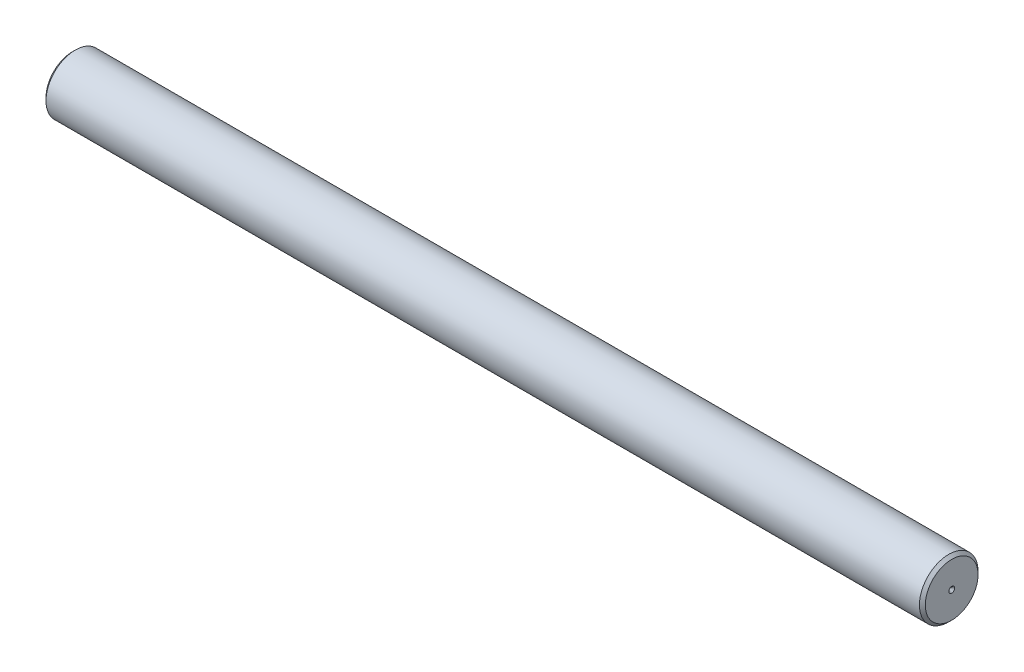
ISO-10303-21;
HEADER;
FILE_DESCRIPTION(('STEP AP214'),'2;1');
FILE_NAME('part.step','',(''),(''),'','','');
FILE_SCHEMA(('AUTOMOTIVE_DESIGN { 1 0 10303 214 1 1 1 1 }'));
ENDSEC;
DATA;
#1=APPLICATION_CONTEXT('core data for automotive mechanical design processes');
#2=APPLICATION_PROTOCOL_DEFINITION('international standard','automotive_design',2000,#1);
#3=PRODUCT_CONTEXT('',#1,'mechanical');
#4=PRODUCT('Part','Part','',(#3));
#5=PRODUCT_RELATED_PRODUCT_CATEGORY('part','',(#4));
#6=PRODUCT_DEFINITION_FORMATION('','',#4);
#7=PRODUCT_DEFINITION_CONTEXT('part definition',#1,'design');
#8=PRODUCT_DEFINITION('design','',#6,#7);
#9=PRODUCT_DEFINITION_SHAPE('','',#8);
#10=(LENGTH_UNIT() NAMED_UNIT(*) SI_UNIT(.MILLI.,.METRE.));
#11=(NAMED_UNIT(*) PLANE_ANGLE_UNIT() SI_UNIT($,.RADIAN.));
#12=(NAMED_UNIT(*) SI_UNIT($,.STERADIAN.) SOLID_ANGLE_UNIT());
#13=UNCERTAINTY_MEASURE_WITH_UNIT(LENGTH_MEASURE(1.E-05),#10,'distance_accuracy_value','');
#14=(GEOMETRIC_REPRESENTATION_CONTEXT(3) GLOBAL_UNCERTAINTY_ASSIGNED_CONTEXT((#13)) GLOBAL_UNIT_ASSIGNED_CONTEXT((#10,
#11,#12)) REPRESENTATION_CONTEXT('',''));
#15=CARTESIAN_POINT('',(0.,0.,0.));
#16=DIRECTION('',(0.,0.,1.));
#17=DIRECTION('',(1.,0.,0.));
#18=AXIS2_PLACEMENT_3D('',#15,#16,#17);
#19=CARTESIAN_POINT('',(150.,5.,0.));
#20=DIRECTION('',(-1.,0.,0.));
#21=DIRECTION('',(0.,0.,1.));
#22=AXIS2_PLACEMENT_3D('',#19,#20,#21);
#23=PLANE('',#22);
#24=CARTESIAN_POINT('',(150.,0.,0.));
#25=DIRECTION('',(-1.,0.,0.));
#26=DIRECTION('',(0.,0.,1.));
#27=AXIS2_PLACEMENT_3D('',#24,#25,#26);
#28=CIRCLE('',#27,4.5);
#29=CARTESIAN_POINT('',(150.,0.,4.5));
#30=VERTEX_POINT('',#29);
#31=EDGE_CURVE('E41',#30,#30,#28,.F.);
#32=ORIENTED_EDGE('',*,*,#31,.T.);
#33=EDGE_LOOP('',(#32));
#34=FACE_BOUND('',#33,.T.);
#35=CARTESIAN_POINT('',(150.,0.,0.));
#36=DIRECTION('',(-1.,0.,0.));
#37=DIRECTION('',(0.,0.,1.));
#38=AXIS2_PLACEMENT_3D('',#35,#36,#37);
#39=CIRCLE('',#38,0.5);
#40=CARTESIAN_POINT('',(150.,0.,0.5));
#41=VERTEX_POINT('',#40);
#42=EDGE_CURVE('E55',#41,#41,#39,.T.);
#43=ORIENTED_EDGE('',*,*,#42,.T.);
#44=EDGE_LOOP('',(#43));
#45=FACE_BOUND('',#44,.T.);
#46=ADVANCED_FACE('F33',(#34,#45),#23,.F.);
#47=CARTESIAN_POINT('',(0.,5.,0.));
#48=DIRECTION('',(1.,0.,0.));
#49=DIRECTION('',(0.,0.,-1.));
#50=AXIS2_PLACEMENT_3D('',#47,#48,#49);
#51=PLANE('',#50);
#52=CARTESIAN_POINT('',(0.,0.,0.));
#53=DIRECTION('',(1.,0.,0.));
#54=DIRECTION('',(0.,0.,-1.));
#55=AXIS2_PLACEMENT_3D('',#52,#53,#54);
#56=CIRCLE('',#55,4.50000000000002);
#57=CARTESIAN_POINT('',(0.,0.,-4.50000000000002));
#58=VERTEX_POINT('',#57);
#59=EDGE_CURVE('E11',#58,#58,#56,.F.);
#60=ORIENTED_EDGE('',*,*,#59,.T.);
#61=EDGE_LOOP('',(#60));
#62=FACE_BOUND('',#61,.T.);
#63=CARTESIAN_POINT('',(0.,0.,0.));
#64=DIRECTION('',(-1.,0.,0.));
#65=DIRECTION('',(0.,0.,1.));
#66=AXIS2_PLACEMENT_3D('',#63,#64,#65);
#67=CIRCLE('',#66,0.5);
#68=CARTESIAN_POINT('',(0.,0.,0.5));
#69=VERTEX_POINT('',#68);
#70=EDGE_CURVE('E57',#69,#69,#67,.T.);
#71=ORIENTED_EDGE('',*,*,#70,.F.);
#72=EDGE_LOOP('',(#71));
#73=FACE_BOUND('',#72,.T.);
#74=ADVANCED_FACE('F78',(#62,#73),#51,.F.);
#75=CARTESIAN_POINT('',(0.,0.,0.));
#76=DIRECTION('',(-1.,0.,0.));
#77=DIRECTION('',(0.,0.,1.));
#78=AXIS2_PLACEMENT_3D('',#75,#76,#77);
#79=CYLINDRICAL_SURFACE('',#78,5.);
#80=CARTESIAN_POINT('',(149.5,0.,0.));
#81=DIRECTION('',(-1.,0.,0.));
#82=DIRECTION('',(0.,0.,1.));
#83=AXIS2_PLACEMENT_3D('',#80,#81,#82);
#84=CIRCLE('',#83,5.);
#85=CARTESIAN_POINT('',(149.5,0.,5.));
#86=VERTEX_POINT('',#85);
#87=EDGE_CURVE('E65',#86,#86,#84,.T.);
#88=ORIENTED_EDGE('',*,*,#87,.T.);
#89=EDGE_LOOP('',(#88));
#90=FACE_BOUND('',#89,.T.);
#91=CARTESIAN_POINT('',(0.499999999999986,0.,0.));
#92=DIRECTION('',(1.,0.,0.));
#93=DIRECTION('',(0.,0.,-1.));
#94=AXIS2_PLACEMENT_3D('',#91,#92,#93);
#95=CIRCLE('',#94,5.);
#96=CARTESIAN_POINT('',(0.499999999999986,0.,-5.));
#97=VERTEX_POINT('',#96);
#98=EDGE_CURVE('E60',#97,#97,#95,.T.);
#99=ORIENTED_EDGE('',*,*,#98,.T.);
#100=EDGE_LOOP('',(#99));
#101=FACE_BOUND('',#100,.T.);
#102=ADVANCED_FACE('F75',(#90,#101),#79,.T.);
#103=CARTESIAN_POINT('',(0.5,0.,0.));
#104=DIRECTION('',(-1.,0.,0.));
#105=DIRECTION('',(0.,0.,1.));
#106=AXIS2_PLACEMENT_3D('',#103,#104,#105);
#107=CONICAL_SURFACE('',#106,0.,0.785398163397448);
#108=ORIENTED_EDGE('',*,*,#70,.T.);
#109=EDGE_LOOP('',(#108));
#110=FACE_BOUND('',#109,.T.);
#111=CARTESIAN_POINT('',(0.5,0.,0.));
#112=VERTEX_POINT('',#111);
#113=VERTEX_LOOP('',#112);
#114=FACE_BOUND('',#113,.T.);
#115=ADVANCED_FACE('F51',(#110,#114),#107,.F.);
#116=CARTESIAN_POINT('',(150.,0.,0.));
#117=DIRECTION('',(1.,0.,0.));
#118=DIRECTION('',(0.,0.,-1.));
#119=AXIS2_PLACEMENT_3D('',#116,#117,#118);
#120=CONICAL_SURFACE('',#119,0.5,0.785398163397448);
#121=CARTESIAN_POINT('',(149.5,0.,0.));
#122=VERTEX_POINT('',#121);
#123=VERTEX_LOOP('',#122);
#124=FACE_BOUND('',#123,.T.);
#125=ORIENTED_EDGE('',*,*,#42,.F.);
#126=EDGE_LOOP('',(#125));
#127=FACE_BOUND('',#126,.T.);
#128=ADVANCED_FACE('F47',(#124,#127),#120,.F.);
#129=CARTESIAN_POINT('',(149.5,0.,0.));
#130=DIRECTION('',(-1.,0.,0.));
#131=DIRECTION('',(0.,0.,1.));
#132=AXIS2_PLACEMENT_3D('',#129,#130,#131);
#133=CONICAL_SURFACE('',#132,5.,0.785398163397472);
#134=ORIENTED_EDGE('',*,*,#31,.F.);
#135=EDGE_LOOP('',(#134));
#136=FACE_BOUND('',#135,.T.);
#137=ORIENTED_EDGE('',*,*,#87,.F.);
#138=EDGE_LOOP('',(#137));
#139=FACE_BOUND('',#138,.T.);
#140=ADVANCED_FACE('F50',(#136,#139),#133,.T.);
#141=CARTESIAN_POINT('',(0.,0.,0.));
#142=DIRECTION('',(1.,0.,0.));
#143=DIRECTION('',(0.,0.,-1.));
#144=AXIS2_PLACEMENT_3D('',#141,#142,#143);
#145=CONICAL_SURFACE('',#144,4.50000000000002,0.785398163397445);
#146=ORIENTED_EDGE('',*,*,#98,.F.);
#147=EDGE_LOOP('',(#146));
#148=FACE_BOUND('',#147,.T.);
#149=ORIENTED_EDGE('',*,*,#59,.F.);
#150=EDGE_LOOP('',(#149));
#151=FACE_BOUND('',#150,.T.);
#152=ADVANCED_FACE('F35',(#148,#151),#145,.T.);
#153=CLOSED_SHELL('',(#46,#74,#102,#115,#128,#140,#152));
#154=MANIFOLD_SOLID_BREP('B2',#153);
#155=ADVANCED_BREP_SHAPE_REPRESENTATION('',(#18,#154),#14);
#156=SHAPE_DEFINITION_REPRESENTATION(#9,#155);
ENDSEC;
END-ISO-10303-21;
